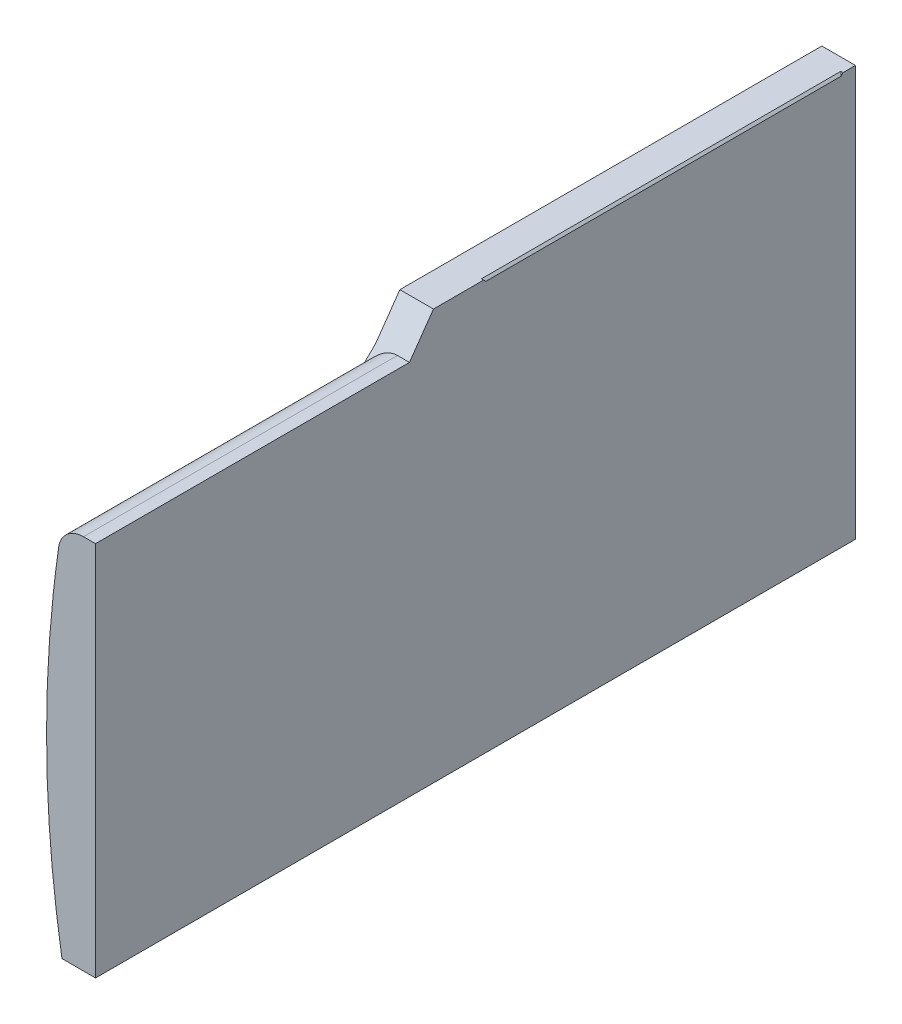
ISO-10303-21;
HEADER;
FILE_DESCRIPTION(('STEP AP214'),'2;1');
FILE_NAME('part.step','',(''),(''),'','','');
FILE_SCHEMA(('AUTOMOTIVE_DESIGN { 1 0 10303 214 1 1 1 1 }'));
ENDSEC;
DATA;
#1=APPLICATION_CONTEXT('core data for automotive mechanical design processes');
#2=APPLICATION_PROTOCOL_DEFINITION('international standard','automotive_design',2000,#1);
#3=PRODUCT_CONTEXT('',#1,'mechanical');
#4=PRODUCT('Part','Part','',(#3));
#5=PRODUCT_RELATED_PRODUCT_CATEGORY('part','',(#4));
#6=PRODUCT_DEFINITION_FORMATION('','',#4);
#7=PRODUCT_DEFINITION_CONTEXT('part definition',#1,'design');
#8=PRODUCT_DEFINITION('design','',#6,#7);
#9=PRODUCT_DEFINITION_SHAPE('','',#8);
#10=(LENGTH_UNIT() NAMED_UNIT(*) SI_UNIT(.MILLI.,.METRE.));
#11=(NAMED_UNIT(*) PLANE_ANGLE_UNIT() SI_UNIT($,.RADIAN.));
#12=(NAMED_UNIT(*) SI_UNIT($,.STERADIAN.) SOLID_ANGLE_UNIT());
#13=UNCERTAINTY_MEASURE_WITH_UNIT(LENGTH_MEASURE(1.E-05),#10,'distance_accuracy_value','');
#14=(GEOMETRIC_REPRESENTATION_CONTEXT(3) GLOBAL_UNCERTAINTY_ASSIGNED_CONTEXT((#13)) GLOBAL_UNIT_ASSIGNED_CONTEXT((#10,
#11,#12)) REPRESENTATION_CONTEXT('',''));
#15=CARTESIAN_POINT('',(0.,0.,0.));
#16=DIRECTION('',(0.,0.,1.));
#17=DIRECTION('',(1.,0.,0.));
#18=AXIS2_PLACEMENT_3D('',#15,#16,#17);
#19=CARTESIAN_POINT('',(-90.,0.,0.));
#20=DIRECTION('',(1.,0.,0.));
#21=DIRECTION('',(0.,0.,-1.));
#22=AXIS2_PLACEMENT_3D('',#19,#20,#21);
#23=PLANE('',#22);
#24=DIRECTION('',(0.,0.,1.));
#25=VECTOR('',#24,1.);
#26=CARTESIAN_POINT('',(-90.,75.4041144568792,59.958086111532));
#27=LINE('',#26,#25);
#28=CARTESIAN_POINT('',(-90.,75.4041144568792,-40.));
#29=VERTEX_POINT('',#28);
#30=CARTESIAN_POINT('',(-90.,75.4041144568792,-37.061913888468));
#31=VERTEX_POINT('',#30);
#32=EDGE_CURVE('E190',#29,#31,#27,.T.);
#33=ORIENTED_EDGE('',*,*,#32,.T.);
#34=DIRECTION('',(0.,-0.707106781186548,0.707106781186547));
#35=VECTOR('',#34,1.);
#36=CARTESIAN_POINT('',(-90.,75.4041144568792,-37.061913888468));
#37=LINE('',#36,#35);
#38=CARTESIAN_POINT('',(-90.,74.8840792640194,-36.5418786956082));
#39=VERTEX_POINT('',#38);
#40=EDGE_CURVE('E184',#31,#39,#37,.T.);
#41=ORIENTED_EDGE('',*,*,#40,.T.);
#42=DIRECTION('',(0.,0.,1.));
#43=VECTOR('',#42,1.);
#44=CARTESIAN_POINT('',(-90.,74.8840792640194,48.078086111532));
#45=LINE('',#44,#43);
#46=CARTESIAN_POINT('',(-90.,74.8840792640194,47.5580509186722));
#47=VERTEX_POINT('',#46);
#48=EDGE_CURVE('E539',#39,#47,#45,.T.);
#49=ORIENTED_EDGE('',*,*,#48,.T.);
#50=DIRECTION('',(0.,0.707106781186548,0.707106781186548));
#51=VECTOR('',#50,1.);
#52=CARTESIAN_POINT('',(-90.,75.4041144568792,48.078086111532));
#53=LINE('',#52,#51);
#54=CARTESIAN_POINT('',(-90.,75.4041144568792,48.078086111532));
#55=VERTEX_POINT('',#54);
#56=EDGE_CURVE('E543',#47,#55,#53,.T.);
#57=ORIENTED_EDGE('',*,*,#56,.T.);
#58=CARTESIAN_POINT('',(-90.,75.4041144568792,59.958086111532));
#59=VERTEX_POINT('',#58);
#60=EDGE_CURVE('E537',#55,#59,#27,.T.);
#61=ORIENTED_EDGE('',*,*,#60,.T.);
#62=DIRECTION('',(0.,-0.819152044288993,0.573576436351045));
#63=VECTOR('',#62,1.);
#64=CARTESIAN_POINT('',(-90.,67.2945092184182,65.6364928314073));
#65=LINE('',#64,#63);
#66=CARTESIAN_POINT('',(-90.,67.2945092184182,65.6364928314073));
#67=VERTEX_POINT('',#66);
#68=EDGE_CURVE('E430',#59,#67,#65,.T.);
#69=ORIENTED_EDGE('',*,*,#68,.T.);
#70=DIRECTION('',(0.,0.,1.));
#71=VECTOR('',#70,1.);
#72=CARTESIAN_POINT('',(-90.,67.2945092184182,144.836492831407));
#73=LINE('',#72,#71);
#74=CARTESIAN_POINT('',(-90.,67.2945092184182,140.));
#75=VERTEX_POINT('',#74);
#76=EDGE_CURVE('E76',#67,#75,#73,.T.);
#77=ORIENTED_EDGE('',*,*,#76,.T.);
#78=DIRECTION('',(0.,1.,0.));
#79=VECTOR('',#78,1.);
#80=CARTESIAN_POINT('',(-90.,0.,140.));
#81=LINE('',#80,#79);
#82=CARTESIAN_POINT('',(-90.,-21.8054907815818,140.));
#83=VERTEX_POINT('',#82);
#84=EDGE_CURVE('E15',#83,#75,#81,.T.);
#85=ORIENTED_EDGE('',*,*,#84,.F.);
#86=DIRECTION('',(0.,0.,-1.));
#87=VECTOR('',#86,1.);
#88=CARTESIAN_POINT('',(-90.,-21.8054907815818,-54.6203206083434));
#89=LINE('',#88,#87);
#90=CARTESIAN_POINT('',(-90.,-21.8054907815818,-40.));
#91=VERTEX_POINT('',#90);
#92=EDGE_CURVE('E165',#83,#91,#89,.T.);
#93=ORIENTED_EDGE('',*,*,#92,.T.);
#94=DIRECTION('',(0.,1.,0.));
#95=VECTOR('',#94,1.);
#96=CARTESIAN_POINT('',(-90.,0.,-40.));
#97=LINE('',#96,#95);
#98=EDGE_CURVE('E488',#91,#29,#97,.T.);
#99=ORIENTED_EDGE('',*,*,#98,.T.);
#100=EDGE_LOOP('',(#33,#41,#49,#57,#61,#69,#77,#85,#93,#99));
#101=FACE_BOUND('',#100,.T.);
#102=ADVANCED_FACE('F60',(#101),#23,.T.);
#103=CARTESIAN_POINT('',(100.042732586601,67.2945092184182,144.836492831407));
#104=DIRECTION('',(0.,-1.,0.));
#105=DIRECTION('',(0.,0.,-1.));
#106=AXIS2_PLACEMENT_3D('',#103,#104,#105);
#107=PLANE('',#106);
#108=ORIENTED_EDGE('',*,*,#76,.F.);
#109=DIRECTION('',(-1.,0.,0.));
#110=VECTOR('',#109,1.);
#111=CARTESIAN_POINT('',(100.042732586601,67.2945092184182,65.6364928314073));
#112=LINE('',#111,#110);
#113=CARTESIAN_POINT('',(-92.8585308869406,67.2945092184182,65.6364928314073));
#114=VERTEX_POINT('',#113);
#115=EDGE_CURVE('E427',#67,#114,#112,.T.);
#116=ORIENTED_EDGE('',*,*,#115,.T.);
#117=DIRECTION('',(0.,0.,1.));
#118=VECTOR('',#117,1.);
#119=CARTESIAN_POINT('',(-92.8585308869406,67.2945092184182,144.836492831407));
#120=LINE('',#119,#118);
#121=CARTESIAN_POINT('',(-92.8585308869406,67.2945092184182,140.));
#122=VERTEX_POINT('',#121);
#123=EDGE_CURVE('E388',#114,#122,#120,.T.);
#124=ORIENTED_EDGE('',*,*,#123,.T.);
#125=DIRECTION('',(-1.,0.,0.));
#126=VECTOR('',#125,1.);
#127=CARTESIAN_POINT('',(100.042732586601,67.2945092184182,140.));
#128=LINE('',#127,#126);
#129=EDGE_CURVE('E202',#75,#122,#128,.T.);
#130=ORIENTED_EDGE('',*,*,#129,.F.);
#131=EDGE_LOOP('',(#108,#116,#124,#130));
#132=FACE_BOUND('',#131,.T.);
#133=ADVANCED_FACE('F398',(#132),#107,.F.);
#134=CARTESIAN_POINT('',(100.042732586601,-21.8054907815818,-54.6203206083434));
#135=DIRECTION('',(0.,1.,0.));
#136=DIRECTION('',(0.,0.,1.));
#137=AXIS2_PLACEMENT_3D('',#134,#135,#136);
#138=PLANE('',#137);
#139=ORIENTED_EDGE('',*,*,#92,.F.);
#140=DIRECTION('',(1.,0.,0.));
#141=VECTOR('',#140,1.);
#142=CARTESIAN_POINT('',(100.042732586601,-21.8054907815818,140.));
#143=LINE('',#142,#141);
#144=CARTESIAN_POINT('',(-97.9572674133995,-21.8054907815818,140.));
#145=VERTEX_POINT('',#144);
#146=EDGE_CURVE('E174',#145,#83,#143,.T.);
#147=ORIENTED_EDGE('',*,*,#146,.F.);
#148=DIRECTION('',(0.,0.,-1.));
#149=VECTOR('',#148,1.);
#150=CARTESIAN_POINT('',(-97.9572674133995,-21.8054907815818,-54.6203206083434));
#151=LINE('',#150,#149);
#152=CARTESIAN_POINT('',(-97.9572674133995,-21.8054907815818,-40.));
#153=VERTEX_POINT('',#152);
#154=EDGE_CURVE('E440',#145,#153,#151,.T.);
#155=ORIENTED_EDGE('',*,*,#154,.T.);
#156=DIRECTION('',(1.,0.,0.));
#157=VECTOR('',#156,1.);
#158=CARTESIAN_POINT('',(100.042732586601,-21.8054907815818,-40.));
#159=LINE('',#158,#157);
#160=EDGE_CURVE('E177',#153,#91,#159,.T.);
#161=ORIENTED_EDGE('',*,*,#160,.T.);
#162=EDGE_LOOP('',(#139,#147,#155,#161));
#163=FACE_BOUND('',#162,.T.);
#164=ADVANCED_FACE('F173',(#163),#138,.F.);
#165=CARTESIAN_POINT('',(0.,0.,-40.));
#166=DIRECTION('',(0.,0.,1.));
#167=DIRECTION('',(1.,0.,0.));
#168=AXIS2_PLACEMENT_3D('',#165,#166,#167);
#169=PLANE('',#168);
#170=ORIENTED_EDGE('',*,*,#98,.F.);
#171=ORIENTED_EDGE('',*,*,#160,.F.);
#172=CARTESIAN_POINT('',(-97.9572674133995,-21.8054907815818,-40.));
#173=CARTESIAN_POINT('',(-105.246647566631,22.4140596268838,-40.));
#174=CARTESIAN_POINT('',(-97.9572674133995,67.2945092184182,-40.));
#175=B_SPLINE_CURVE_WITH_KNOTS('',2,(#172,#173,#174),.UNSPECIFIED.,.F.,.F.,(3,3),(0.,1.),.UNSPECIFIED.);
#176=CARTESIAN_POINT('',(-99.0095655562742,-14.8754907815818,-40.));
#177=VERTEX_POINT('',#176);
#178=EDGE_CURVE('E485',#153,#177,#175,.T.);
#179=ORIENTED_EDGE('',*,*,#178,.T.);
#180=DIRECTION('',(-1.,0.,0.));
#181=VECTOR('',#180,1.);
#182=CARTESIAN_POINT('',(-111.808505715063,-14.8754907815818,-40.));
#183=LINE('',#182,#181);
#184=CARTESIAN_POINT('',(-103.007016542361,-14.8754907815818,-40.));
#185=VERTEX_POINT('',#184);
#186=EDGE_CURVE('E497',#177,#185,#183,.T.);
#187=ORIENTED_EDGE('',*,*,#186,.T.);
#188=CARTESIAN_POINT('',(-103.007016542361,-14.8754907815818,-40.));
#189=CARTESIAN_POINT('',(-103.267955840964,-12.9688822326603,-40.));
#190=CARTESIAN_POINT('',(-103.509130121579,-11.0595688180607,-40.));
#191=CARTESIAN_POINT('',(-103.951700372503,-7.23633384782891,-40.));
#192=CARTESIAN_POINT('',(-104.153096260259,-5.32241228264187,-40.));
#193=CARTESIAN_POINT('',(-104.515845485826,-1.49092769164326,-40.));
#194=CARTESIAN_POINT('',(-104.677202107289,0.426635022549333,-40.));
#195=CARTESIAN_POINT('',(-104.959733838818,4.26468769842888,-40.));
#196=CARTESIAN_POINT('',(-105.080908960257,6.18517765928714,-39.9999999999999));
#197=CARTESIAN_POINT('',(-105.383993991369,11.9498699583568,-39.9999999999999));
#198=CARTESIAN_POINT('',(-105.505475534972,15.7974210442789,-40.));
#199=CARTESIAN_POINT('',(-105.587274680429,23.494410249203,-40.));
#200=CARTESIAN_POINT('',(-105.547582892983,27.3438484650793,-40.));
#201=CARTESIAN_POINT('',(-105.350707339962,33.6726552616225,-40.));
#202=CARTESIAN_POINT('',(-105.240203868745,36.1535678313806,-40.));
#203=CARTESIAN_POINT('',(-104.953172849059,41.1116683579451,-40.));
#204=CARTESIAN_POINT('',(-104.776643502676,43.5888562114813,-40.));
#205=CARTESIAN_POINT('',(-104.358250633031,48.5379927241587,-40.));
#206=CARTESIAN_POINT('',(-104.116379214136,51.0099407137344,-40.));
#207=CARTESIAN_POINT('',(-103.568246582062,55.9465928787224,-40.));
#208=CARTESIAN_POINT('',(-103.261987885307,58.4112973334151,-40.));
#209=CARTESIAN_POINT('',(-102.923993487087,60.8716246324162,-40.));
#210=B_SPLINE_CURVE_WITH_KNOTS('',3,(#188,#189,#190,#191,#192,#193,#194,#195,#196,#197,#198,
#199,#200,#201,#202,#203,#204,#205,#206,#207,#208,#209),.UNSPECIFIED.,.F.,.F.,(4,2,2,2,2,2,2,2,
2,2,4),(0.,5.77303999359552,11.5460919677799,17.3186703327862,23.0912470638909,34.6360201385131,
46.1814657740123,53.6307761344694,61.0802893577584,68.5307031484708,75.9808258114308),.UNSPECIFIED.);
#211=CARTESIAN_POINT('',(-102.923993487087,60.8716246324162,-40.));
#212=VERTEX_POINT('',#211);
#213=EDGE_CURVE('E83',#185,#212,#210,.T.);
#214=ORIENTED_EDGE('',*,*,#213,.T.);
#215=DIRECTION('',(-0.801476168478863,-0.598026714587602,0.));
#216=VECTOR('',#215,1.);
#217=CARTESIAN_POINT('',(-103.603630214132,60.3645092184182,-40.));
#218=LINE('',#217,#216);
#219=CARTESIAN_POINT('',(-98.4400351928598,64.2173596055894,-40.));
#220=VERTEX_POINT('',#219);
#221=EDGE_CURVE('E69',#220,#212,#218,.T.);
#222=ORIENTED_EDGE('',*,*,#221,.F.);
#223=CARTESIAN_POINT('',(-97.9572674133995,67.2945092184182,-40.));
#224=VERTEX_POINT('',#223);
#225=EDGE_CURVE('E213',#220,#224,#175,.T.);
#226=ORIENTED_EDGE('',*,*,#225,.T.);
#227=DIRECTION('',(0.,1.,0.));
#228=VECTOR('',#227,1.);
#229=CARTESIAN_POINT('',(-97.9572674133995,-21.8054907815818,-40.));
#230=LINE('',#229,#228);
#231=CARTESIAN_POINT('',(-97.9572674133995,75.4041144568792,-40.));
#232=VERTEX_POINT('',#231);
#233=EDGE_CURVE('E524',#224,#232,#230,.T.);
#234=ORIENTED_EDGE('',*,*,#233,.T.);
#235=DIRECTION('',(-1.,0.,0.));
#236=VECTOR('',#235,1.);
#237=CARTESIAN_POINT('',(100.042732586601,75.4041144568792,-40.));
#238=LINE('',#237,#236);
#239=EDGE_CURVE('E526',#29,#232,#238,.T.);
#240=ORIENTED_EDGE('',*,*,#239,.F.);
#241=EDGE_LOOP('',(#170,#171,#179,#187,#214,#222,#226,#234,#240));
#242=FACE_BOUND('',#241,.T.);
#243=ADVANCED_FACE('F221',(#242),#169,.F.);
#244=CARTESIAN_POINT('',(-90.5200351928598,75.4041144568792,48.078086111532));
#245=DIRECTION('',(-0.707106781186548,-0.707106781186547,0.));
#246=DIRECTION('',(0.,0.,-1.));
#247=AXIS2_PLACEMENT_3D('',#244,#245,#246);
#248=PLANE('',#247);
#249=ORIENTED_EDGE('',*,*,#48,.F.);
#250=DIRECTION('',(0.577350269189626,-0.577350269189626,0.577350269189625));
#251=VECTOR('',#250,1.);
#252=CARTESIAN_POINT('',(-62.1400351928598,47.0241144568792,-8.68191388846802));
#253=LINE('',#252,#251);
#254=CARTESIAN_POINT('',(-90.5200351928598,75.4041144568792,-37.061913888468));
#255=VERTEX_POINT('',#254);
#256=EDGE_CURVE('E475',#255,#39,#253,.T.);
#257=ORIENTED_EDGE('',*,*,#256,.F.);
#258=DIRECTION('',(0.,0.,1.));
#259=VECTOR('',#258,1.);
#260=CARTESIAN_POINT('',(-90.5200351928598,75.4041144568792,48.078086111532));
#261=LINE('',#260,#259);
#262=CARTESIAN_POINT('',(-90.5200351928598,75.4041144568792,48.078086111532));
#263=VERTEX_POINT('',#262);
#264=EDGE_CURVE('E490',#255,#263,#261,.T.);
#265=ORIENTED_EDGE('',*,*,#264,.T.);
#266=DIRECTION('',(0.577350269189626,-0.577350269189626,-0.577350269189626));
#267=VECTOR('',#266,1.);
#268=CARTESIAN_POINT('',(-29.6391125997064,14.5231918637258,-12.8028364816214));
#269=LINE('',#268,#267);
#270=EDGE_CURVE('E472',#263,#47,#269,.T.);
#271=ORIENTED_EDGE('',*,*,#270,.T.);
#272=EDGE_LOOP('',(#249,#257,#265,#271));
#273=FACE_BOUND('',#272,.T.);
#274=ADVANCED_FACE('F226',(#273),#248,.F.);
#275=CARTESIAN_POINT('',(92.1227325866005,75.4041144568792,48.078086111532));
#276=DIRECTION('',(0.,-0.707106781186547,0.707106781186547));
#277=DIRECTION('',(-1.,0.,0.));
#278=AXIS2_PLACEMENT_3D('',#275,#276,#277);
#279=PLANE('',#278);
#280=ORIENTED_EDGE('',*,*,#56,.F.);
#281=ORIENTED_EDGE('',*,*,#270,.F.);
#282=DIRECTION('',(1.,0.,0.));
#283=VECTOR('',#282,1.);
#284=CARTESIAN_POINT('',(92.1227325866005,75.4041144568792,48.078086111532));
#285=LINE('',#284,#283);
#286=EDGE_CURVE('E495',#263,#55,#285,.T.);
#287=ORIENTED_EDGE('',*,*,#286,.T.);
#288=EDGE_LOOP('',(#280,#281,#287));
#289=FACE_BOUND('',#288,.T.);
#290=ADVANCED_FACE('F408',(#289),#279,.F.);
#291=CARTESIAN_POINT('',(92.1227325866005,75.4041144568792,-37.061913888468));
#292=DIRECTION('',(0.,-0.707106781186547,-0.707106781186548));
#293=DIRECTION('',(1.,0.,0.));
#294=AXIS2_PLACEMENT_3D('',#291,#292,#293);
#295=PLANE('',#294);
#296=ORIENTED_EDGE('',*,*,#40,.F.);
#297=DIRECTION('',(-1.,0.,0.));
#298=VECTOR('',#297,1.);
#299=CARTESIAN_POINT('',(92.1227325866005,75.4041144568792,-37.061913888468));
#300=LINE('',#299,#298);
#301=EDGE_CURVE('E503',#31,#255,#300,.T.);
#302=ORIENTED_EDGE('',*,*,#301,.T.);
#303=ORIENTED_EDGE('',*,*,#256,.T.);
#304=EDGE_LOOP('',(#296,#302,#303));
#305=FACE_BOUND('',#304,.T.);
#306=ADVANCED_FACE('F401',(#305),#295,.F.);
#307=CARTESIAN_POINT('',(100.042732586601,75.4041144568792,59.958086111532));
#308=DIRECTION('',(0.,-1.,0.));
#309=DIRECTION('',(0.,0.,-1.));
#310=AXIS2_PLACEMENT_3D('',#307,#308,#309);
#311=PLANE('',#310);
#312=ORIENTED_EDGE('',*,*,#32,.F.);
#313=ORIENTED_EDGE('',*,*,#239,.T.);
#314=DIRECTION('',(0.,0.,1.));
#315=VECTOR('',#314,1.);
#316=CARTESIAN_POINT('',(-97.9572674133995,75.4041144568792,59.958086111532));
#317=LINE('',#316,#315);
#318=CARTESIAN_POINT('',(-97.9572674133995,75.4041144568792,59.958086111532));
#319=VERTEX_POINT('',#318);
#320=EDGE_CURVE('E532',#232,#319,#317,.T.);
#321=ORIENTED_EDGE('',*,*,#320,.T.);
#322=DIRECTION('',(-1.,0.,0.));
#323=VECTOR('',#322,1.);
#324=CARTESIAN_POINT('',(100.042732586601,75.4041144568792,59.958086111532));
#325=LINE('',#324,#323);
#326=EDGE_CURVE('E439',#59,#319,#325,.T.);
#327=ORIENTED_EDGE('',*,*,#326,.F.);
#328=ORIENTED_EDGE('',*,*,#60,.F.);
#329=ORIENTED_EDGE('',*,*,#286,.F.);
#330=ORIENTED_EDGE('',*,*,#264,.F.);
#331=ORIENTED_EDGE('',*,*,#301,.F.);
#332=EDGE_LOOP('',(#312,#313,#321,#327,#328,#329,#330,#331));
#333=FACE_BOUND('',#332,.T.);
#334=ADVANCED_FACE('F396',(#333),#311,.F.);
#335=CARTESIAN_POINT('',(100.042732586601,67.2945092184182,65.6364928314073));
#336=DIRECTION('',(0.,-0.573576436351045,-0.819152044288993));
#337=DIRECTION('',(0.,0.819152044288993,-0.573576436351045));
#338=AXIS2_PLACEMENT_3D('',#335,#336,#337);
#339=PLANE('',#338);
#340=ORIENTED_EDGE('',*,*,#68,.F.);
#341=ORIENTED_EDGE('',*,*,#326,.T.);
#342=DIRECTION('',(0.,-0.819152044288993,0.573576436351045));
#343=VECTOR('',#342,1.);
#344=CARTESIAN_POINT('',(-97.9572674133995,67.2945092184182,65.6364928314073));
#345=LINE('',#344,#343);
#346=CARTESIAN_POINT('',(-97.9572674133995,67.2945092184182,65.6364928314074));
#347=VERTEX_POINT('',#346);
#348=EDGE_CURVE('E446',#319,#347,#345,.T.);
#349=ORIENTED_EDGE('',*,*,#348,.T.);
#350=CARTESIAN_POINT('',(-98.7378033975358,62.2017132942812,69.2025069280517));
#351=CARTESIAN_POINT('',(-98.615367400328,63.0512996903588,68.6076201291578));
#352=CARTESIAN_POINT('',(-98.4891047363793,63.9004925487424,68.0130088883237));
#353=CARTESIAN_POINT('',(-98.2289260750006,65.5980911901214,66.8243375227756));
#354=CARTESIAN_POINT('',(-98.0950100775704,66.4464969731168,66.2302773980615));
#355=CARTESIAN_POINT('',(-97.9572674133995,67.2945092184182,65.6364928314073));
#356=B_SPLINE_CURVE_WITH_KNOTS('',3,(#350,#351,#352,#353,#354,#355),.UNSPECIFIED.,.F.,.F.,(4,2,
4),(0.,3.13300170585154,6.26600341170309),.UNSPECIFIED.);
#357=CARTESIAN_POINT('',(-98.7378033975358,62.2017132942812,69.2025069280517));
#358=VERTEX_POINT('',#357);
#359=EDGE_CURVE('E273',#358,#347,#356,.T.);
#360=ORIENTED_EDGE('',*,*,#359,.F.);
#361=CARTESIAN_POINT('',(-92.8585308869406,61.3545092184182,69.795725608373));
#362=DIRECTION('',(0.,-0.573576436351045,-0.819152044288993));
#363=DIRECTION('',(0.,0.819152044288993,-0.573576436351045));
#364=AXIS2_PLACEMENT_3D('',#361,#362,#363);
#365=ELLIPSE('',#364,7.25140105724304,5.94);
#366=EDGE_CURVE('E436',#358,#114,#365,.T.);
#367=ORIENTED_EDGE('',*,*,#366,.T.);
#368=ORIENTED_EDGE('',*,*,#115,.F.);
#369=EDGE_LOOP('',(#340,#341,#349,#360,#367,#368));
#370=FACE_BOUND('',#369,.T.);
#371=ADVANCED_FACE('F391',(#370),#339,.F.);
#372=CARTESIAN_POINT('',(0.,0.,140.));
#373=DIRECTION('',(0.,0.,1.));
#374=DIRECTION('',(1.,0.,0.));
#375=AXIS2_PLACEMENT_3D('',#372,#373,#374);
#376=PLANE('',#375);
#377=ORIENTED_EDGE('',*,*,#146,.T.);
#378=ORIENTED_EDGE('',*,*,#84,.T.);
#379=ORIENTED_EDGE('',*,*,#129,.T.);
#380=CARTESIAN_POINT('',(-92.8585308869406,61.3545092184182,140.));
#381=DIRECTION('',(0.,0.,1.));
#382=DIRECTION('',(1.,0.,0.));
#383=AXIS2_PLACEMENT_3D('',#380,#381,#382);
#384=CIRCLE('',#383,5.94);
#385=CARTESIAN_POINT('',(-98.7378033975359,62.2017132942812,140.));
#386=VERTEX_POINT('',#385);
#387=EDGE_CURVE('E188',#386,#122,#384,.F.);
#388=ORIENTED_EDGE('',*,*,#387,.F.);
#389=CARTESIAN_POINT('',(-97.9572674133995,-21.8054907815818,140.));
#390=CARTESIAN_POINT('',(-105.246647566631,22.4140596268838,140.));
#391=CARTESIAN_POINT('',(-97.9572674133995,67.2945092184182,140.));
#392=B_SPLINE_CURVE_WITH_KNOTS('',2,(#389,#390,#391),.UNSPECIFIED.,.F.,.F.,(3,3),(0.,1.),.UNSPECIFIED.);
#393=EDGE_CURVE('E182',#145,#386,#392,.T.);
#394=ORIENTED_EDGE('',*,*,#393,.F.);
#395=EDGE_LOOP('',(#377,#378,#379,#388,#394));
#396=FACE_BOUND('',#395,.T.);
#397=ADVANCED_FACE('F180',(#396),#376,.T.);
#398=CARTESIAN_POINT('',(-97.9572674133995,-21.8054907815818,311.41423626744));
#399=CARTESIAN_POINT('',(-105.246647566631,22.4140596268838,311.41423626744));
#400=CARTESIAN_POINT('',(-97.9572674133995,67.2945092184182,311.41423626744));
#401=B_SPLINE_CURVE_WITH_KNOTS('',2,(#398,#399,#400),.UNSPECIFIED.,.F.,.F.,(3,3),(0.,1.),.UNSPECIFIED.);
#402=DIRECTION('',(0.,0.,-1.));
#403=VECTOR('',#402,1.);
#404=SURFACE_OF_LINEAR_EXTRUSION('',#401,#403);
#405=ORIENTED_EDGE('',*,*,#154,.F.);
#406=ORIENTED_EDGE('',*,*,#393,.T.);
#407=DIRECTION('',(0.,0.,-1.));
#408=VECTOR('',#407,1.);
#409=CARTESIAN_POINT('',(-98.7378033975358,62.2017132942812,149.109856013012));
#410=LINE('',#409,#408);
#411=EDGE_CURVE('E387',#386,#358,#410,.T.);
#412=ORIENTED_EDGE('',*,*,#411,.T.);
#413=ORIENTED_EDGE('',*,*,#359,.T.);
#414=DIRECTION('',(0.,0.,-1.));
#415=VECTOR('',#414,1.);
#416=CARTESIAN_POINT('',(-97.9572674133995,67.2945092184182,311.41423626744));
#417=LINE('',#416,#415);
#418=EDGE_CURVE('E250',#347,#224,#417,.T.);
#419=ORIENTED_EDGE('',*,*,#418,.T.);
#420=ORIENTED_EDGE('',*,*,#225,.F.);
#421=DIRECTION('',(0.,0.,-1.));
#422=VECTOR('',#421,1.);
#423=CARTESIAN_POINT('',(-98.4400351928598,64.2173596055893,-48.941913888468));
#424=LINE('',#423,#422);
#425=CARTESIAN_POINT('',(-98.4400351928598,64.2173596055893,59.958086111532));
#426=VERTEX_POINT('',#425);
#427=EDGE_CURVE('E461',#220,#426,#424,.F.);
#428=ORIENTED_EDGE('',*,*,#427,.T.);
#429=CARTESIAN_POINT('',(-97.9572674133995,-21.8054907815818,59.958086111532));
#430=CARTESIAN_POINT('',(-105.246647566631,22.4140596268838,59.958086111532));
#431=CARTESIAN_POINT('',(-97.9572674133995,67.2945092184182,59.958086111532));
#432=B_SPLINE_CURVE_WITH_KNOTS('',2,(#429,#430,#431),.UNSPECIFIED.,.F.,.F.,(3,3),(0.,1.),.UNSPECIFIED.);
#433=CARTESIAN_POINT('',(-99.0095655562743,-14.8754907890754,59.958086111532));
#434=VERTEX_POINT('',#433);
#435=EDGE_CURVE('E444',#434,#426,#432,.T.);
#436=ORIENTED_EDGE('',*,*,#435,.F.);
#437=DIRECTION('',(0.,0.,-1.));
#438=VECTOR('',#437,1.);
#439=CARTESIAN_POINT('',(-99.0095655573148,-14.8754907815818,68.0911060975608));
#440=LINE('',#439,#438);
#441=EDGE_CURVE('E455',#177,#434,#440,.F.);
#442=ORIENTED_EDGE('',*,*,#441,.F.);
#443=ORIENTED_EDGE('',*,*,#178,.F.);
#444=EDGE_LOOP('',(#405,#406,#412,#413,#419,#420,#428,#436,#442,#443));
#445=FACE_BOUND('',#444,.T.);
#446=ADVANCED_FACE('F264',(#445),#404,.T.);
#447=CARTESIAN_POINT('',(-92.8585308869406,61.3545092184182,105.236492831407));
#448=DIRECTION('',(0.,0.,-1.));
#449=DIRECTION('',(0.,1.,0.));
#450=AXIS2_PLACEMENT_3D('',#447,#448,#449);
#451=CYLINDRICAL_SURFACE('',#450,5.94);
#452=ORIENTED_EDGE('',*,*,#411,.F.);
#453=ORIENTED_EDGE('',*,*,#387,.T.);
#454=ORIENTED_EDGE('',*,*,#123,.F.);
#455=ORIENTED_EDGE('',*,*,#366,.F.);
#456=EDGE_LOOP('',(#452,#453,#454,#455));
#457=FACE_BOUND('',#456,.T.);
#458=ADVANCED_FACE('F62',(#457),#451,.T.);
#459=CARTESIAN_POINT('',(-97.9572674133995,-21.8054907815818,-54.6203206083434));
#460=DIRECTION('',(-1.,0.,0.));
#461=DIRECTION('',(0.,0.,1.));
#462=AXIS2_PLACEMENT_3D('',#459,#460,#461);
#463=PLANE('',#462);
#464=ORIENTED_EDGE('',*,*,#233,.F.);
#465=ORIENTED_EDGE('',*,*,#418,.F.);
#466=ORIENTED_EDGE('',*,*,#348,.F.);
#467=ORIENTED_EDGE('',*,*,#320,.F.);
#468=EDGE_LOOP('',(#464,#465,#466,#467));
#469=FACE_BOUND('',#468,.T.);
#470=ADVANCED_FACE('F269',(#469),#463,.T.);
#471=CARTESIAN_POINT('',(-97.9572674133995,-21.8054907815818,311.41423626744));
#472=CARTESIAN_POINT('',(-105.246647566631,22.4140596268838,311.41423626744));
#473=CARTESIAN_POINT('',(-97.9572674133995,67.2945092184182,311.41423626744));
#474=B_SPLINE_CURVE_WITH_KNOTS('',2,(#471,#472,#473),.UNSPECIFIED.,.F.,.F.,(3,3),(0.,1.),.UNSPECIFIED.);
#475=DIRECTION('',(0.,0.,-1.));
#476=VECTOR('',#475,1.);
#477=SURFACE_OF_LINEAR_EXTRUSION('',#474,#476);
#478=OFFSET_SURFACE('',#477,3.96,.F.);
#479=ORIENTED_EDGE('',*,*,#213,.F.);
#480=DIRECTION('',(0.,0.,-1.));
#481=VECTOR('',#480,1.);
#482=CARTESIAN_POINT('',(-103.007016542361,-14.8754907815818,311.41423626744));
#483=LINE('',#482,#481);
#484=CARTESIAN_POINT('',(-103.007016542361,-14.8754907815818,59.958086111532));
#485=VERTEX_POINT('',#484);
#486=EDGE_CURVE('E245',#485,#185,#483,.T.);
#487=ORIENTED_EDGE('',*,*,#486,.F.);
#488=CARTESIAN_POINT('',(-102.923993487087,60.8716246324162,59.958086111532));
#489=CARTESIAN_POINT('',(-102.947210840919,60.7026075009912,59.958086111532));
#490=CARTESIAN_POINT('',(-102.970278688625,60.5335689293928,59.958086111532));
#491=CARTESIAN_POINT('',(-103.510089745699,56.5515631797213,59.958086111532));
#492=CARTESIAN_POINT('',(-103.950847320005,52.7278640519761,59.958086111532));
#493=CARTESIAN_POINT('',(-104.676306939411,45.0652646912589,59.958086111532));
#494=CARTESIAN_POINT('',(-104.960984664278,41.2263621831211,59.958086111532));
#495=CARTESIAN_POINT('',(-105.371443705613,33.5400350982791,59.958086111532));
#496=CARTESIAN_POINT('',(-105.497225961207,29.6926105720776,59.958086111532));
#497=CARTESIAN_POINT('',(-105.588118783588,21.9958889228424,59.958086111532));
#498=CARTESIAN_POINT('',(-105.553234365777,18.1465918620128,59.9580861115319));
#499=CARTESIAN_POINT('',(-105.364454148358,11.8604376942364,59.958086111532));
#500=CARTESIAN_POINT('',(-105.258765301006,9.42202892540406,59.958086111532));
#501=CARTESIAN_POINT('',(-104.982608892524,4.54879181172405,59.958086111532));
#502=CARTESIAN_POINT('',(-104.812139921473,2.11396354596296,59.958086111532));
#503=CARTESIAN_POINT('',(-104.406603161347,-2.75092090587024,59.958086111532));
#504=CARTESIAN_POINT('',(-104.171518893473,-5.18097571513524,59.958086111532));
#505=CARTESIAN_POINT('',(-103.637236977968,-10.0339704530732,59.958086111532));
#506=CARTESIAN_POINT('',(-103.338040835426,-12.4569105474177,59.9580861115319));
#507=CARTESIAN_POINT('',(-103.007016542361,-14.8754907815818,59.9580861115317));
#508=B_SPLINE_CURVE_WITH_KNOTS('',3,(#488,#489,#490,#491,#492,#493,#494,#495,#496,#497,#498,
#499,#500,#501,#502,#503,#504,#505,#506,#507),.UNSPECIFIED.,.F.,.F.,(4,2,2,2,2,2,2,2,2,4),(0.,
0.511815543260227,12.0552225263149,23.6004276827473,35.1455646028977,46.6903411303614,
54.0116615971721,61.333141419485,68.6564901693856,75.9796670153321),.UNSPECIFIED.);
#509=CARTESIAN_POINT('',(-102.923993487087,60.8716246324162,59.958086111532));
#510=VERTEX_POINT('',#509);
#511=EDGE_CURVE('E235',#510,#485,#508,.T.);
#512=ORIENTED_EDGE('',*,*,#511,.F.);
#513=DIRECTION('',(0.,0.,-1.));
#514=VECTOR('',#513,1.);
#515=CARTESIAN_POINT('',(-102.923993487087,60.8716246324162,5.50808611153199));
#516=LINE('',#515,#514);
#517=EDGE_CURVE('E464',#510,#212,#516,.T.);
#518=ORIENTED_EDGE('',*,*,#517,.T.);
#519=EDGE_LOOP('',(#479,#487,#512,#518));
#520=FACE_BOUND('',#519,.T.);
#521=ADVANCED_FACE('F217',(#520),#478,.T.);
#522=CARTESIAN_POINT('',(-111.808505715063,-14.8754907815818,59.958086111532));
#523=DIRECTION('',(0.,-1.,0.));
#524=DIRECTION('',(0.,0.,-1.));
#525=AXIS2_PLACEMENT_3D('',#522,#523,#524);
#526=PLANE('',#525);
#527=ORIENTED_EDGE('',*,*,#186,.F.);
#528=ORIENTED_EDGE('',*,*,#441,.T.);
#529=DIRECTION('',(1.,0.,0.));
#530=VECTOR('',#529,1.);
#531=CARTESIAN_POINT('',(-111.808505715063,-14.8754907815818,59.958086111532));
#532=LINE('',#531,#530);
#533=EDGE_CURVE('E244',#485,#434,#532,.T.);
#534=ORIENTED_EDGE('',*,*,#533,.F.);
#535=ORIENTED_EDGE('',*,*,#486,.T.);
#536=EDGE_LOOP('',(#527,#528,#534,#535));
#537=FACE_BOUND('',#536,.T.);
#538=ADVANCED_FACE('F232',(#537),#526,.T.);
#539=CARTESIAN_POINT('',(-111.808505715063,60.3645092184182,59.958086111532));
#540=DIRECTION('',(0.,0.,1.));
#541=DIRECTION('',(1.,0.,0.));
#542=AXIS2_PLACEMENT_3D('',#539,#540,#541);
#543=PLANE('',#542);
#544=ORIENTED_EDGE('',*,*,#533,.T.);
#545=ORIENTED_EDGE('',*,*,#435,.T.);
#546=DIRECTION('',(-0.801476168478863,-0.598026714587602,0.));
#547=VECTOR('',#546,1.);
#548=CARTESIAN_POINT('',(-103.603630214132,60.3645092184182,59.958086111532));
#549=LINE('',#548,#547);
#550=EDGE_CURVE('E468',#426,#510,#549,.T.);
#551=ORIENTED_EDGE('',*,*,#550,.T.);
#552=ORIENTED_EDGE('',*,*,#511,.T.);
#553=EDGE_LOOP('',(#544,#545,#551,#552));
#554=FACE_BOUND('',#553,.T.);
#555=ADVANCED_FACE('F228',(#554),#543,.T.);
#556=CARTESIAN_POINT('',(-103.603630214132,60.3645092184182,5.50808611153199));
#557=DIRECTION('',(0.598026714587602,-0.801476168478863,0.));
#558=DIRECTION('',(0.,0.,-1.));
#559=AXIS2_PLACEMENT_3D('',#556,#557,#558);
#560=PLANE('',#559);
#561=ORIENTED_EDGE('',*,*,#427,.F.);
#562=ORIENTED_EDGE('',*,*,#221,.T.);
#563=ORIENTED_EDGE('',*,*,#517,.F.);
#564=ORIENTED_EDGE('',*,*,#550,.F.);
#565=EDGE_LOOP('',(#561,#562,#563,#564));
#566=FACE_BOUND('',#565,.T.);
#567=ADVANCED_FACE('F231',(#566),#560,.F.);
#568=CLOSED_SHELL('',(#102,#133,#164,#243,#274,#290,#306,#334,#371,#397,#446,#458,#470,#521,
#538,#555,#567));
#569=MANIFOLD_SOLID_BREP('B2',#568);
#570=ADVANCED_BREP_SHAPE_REPRESENTATION('',(#18,#569),#14);
#571=SHAPE_DEFINITION_REPRESENTATION(#9,#570);
ENDSEC;
END-ISO-10303-21;
